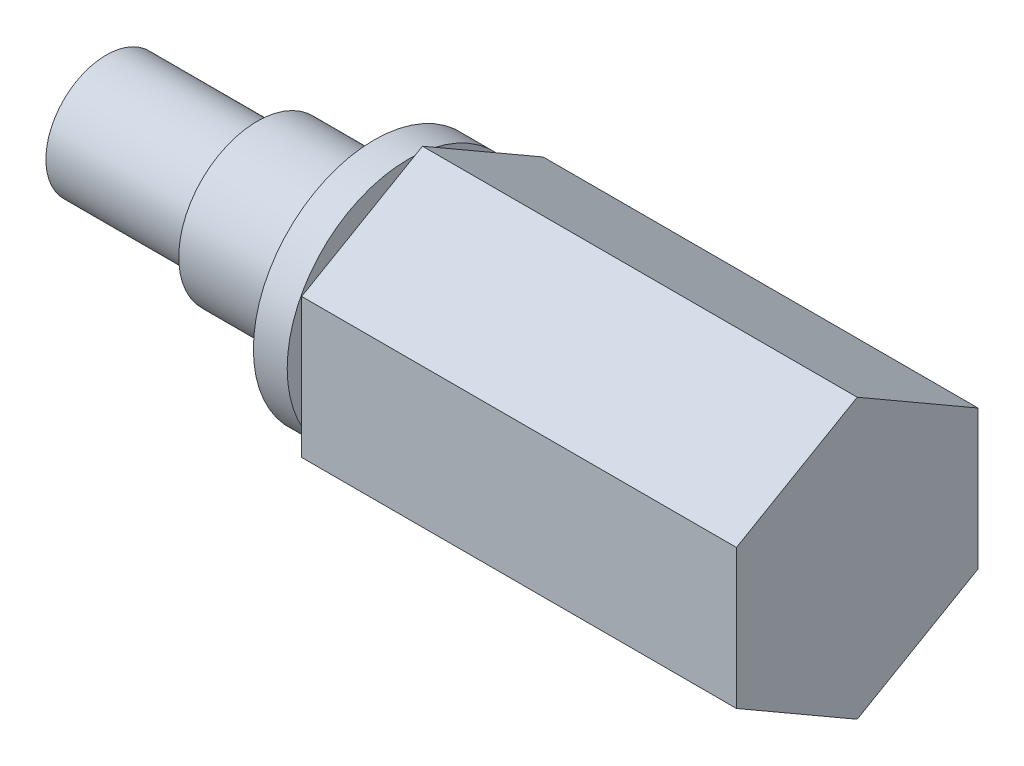
ISO-10303-21;
HEADER;
FILE_DESCRIPTION(('STEP AP214'),'2;1');
FILE_NAME('part.step','',(''),(''),'','','');
FILE_SCHEMA(('AUTOMOTIVE_DESIGN { 1 0 10303 214 1 1 1 1 }'));
ENDSEC;
DATA;
#1=APPLICATION_CONTEXT('core data for automotive mechanical design processes');
#2=APPLICATION_PROTOCOL_DEFINITION('international standard','automotive_design',2000,#1);
#3=PRODUCT_CONTEXT('',#1,'mechanical');
#4=PRODUCT('Part','Part','',(#3));
#5=PRODUCT_RELATED_PRODUCT_CATEGORY('part','',(#4));
#6=PRODUCT_DEFINITION_FORMATION('','',#4);
#7=PRODUCT_DEFINITION_CONTEXT('part definition',#1,'design');
#8=PRODUCT_DEFINITION('design','',#6,#7);
#9=PRODUCT_DEFINITION_SHAPE('','',#8);
#10=(LENGTH_UNIT() NAMED_UNIT(*) SI_UNIT(.MILLI.,.METRE.));
#11=(NAMED_UNIT(*) PLANE_ANGLE_UNIT() SI_UNIT($,.RADIAN.));
#12=(NAMED_UNIT(*) SI_UNIT($,.STERADIAN.) SOLID_ANGLE_UNIT());
#13=UNCERTAINTY_MEASURE_WITH_UNIT(LENGTH_MEASURE(1.E-05),#10,'distance_accuracy_value','');
#14=(GEOMETRIC_REPRESENTATION_CONTEXT(3) GLOBAL_UNCERTAINTY_ASSIGNED_CONTEXT((#13)) GLOBAL_UNIT_ASSIGNED_CONTEXT((#10,
#11,#12)) REPRESENTATION_CONTEXT('',''));
#15=CARTESIAN_POINT('',(0.,0.,0.));
#16=DIRECTION('',(0.,0.,1.));
#17=DIRECTION('',(1.,0.,0.));
#18=AXIS2_PLACEMENT_3D('',#15,#16,#17);
#19=CARTESIAN_POINT('',(-22.86,6.35,0.));
#20=DIRECTION('',(-1.,0.,0.));
#21=DIRECTION('',(0.,0.,1.));
#22=AXIS2_PLACEMENT_3D('',#19,#20,#21);
#23=PLANE('',#22);
#24=CARTESIAN_POINT('',(-22.86,0.,0.));
#25=DIRECTION('',(1.,0.,0.));
#26=DIRECTION('',(0.,0.,-1.));
#27=AXIS2_PLACEMENT_3D('',#24,#25,#26);
#28=CIRCLE('',#27,5.24168743665283);
#29=CARTESIAN_POINT('',(-22.86,0.,-5.24168743665283));
#30=VERTEX_POINT('',#29);
#31=EDGE_CURVE('E11',#30,#30,#28,.T.);
#32=ORIENTED_EDGE('',*,*,#31,.T.);
#33=EDGE_LOOP('',(#32));
#34=FACE_BOUND('',#33,.T.);
#35=DIRECTION('',(0.,-0.5,0.866025403784438));
#36=VECTOR('',#35,1.);
#37=CARTESIAN_POINT('',(-22.86,7.33234841870825,0.));
#38=LINE('',#37,#36);
#39=CARTESIAN_POINT('',(-22.86,7.33234841870825,0.));
#40=VERTEX_POINT('',#39);
#41=CARTESIAN_POINT('',(-22.86,3.66617420935412,6.35));
#42=VERTEX_POINT('',#41);
#43=EDGE_CURVE('E123',#40,#42,#38,.T.);
#44=ORIENTED_EDGE('',*,*,#43,.F.);
#45=DIRECTION('',(0.,0.5,0.866025403784439));
#46=VECTOR('',#45,1.);
#47=CARTESIAN_POINT('',(-22.86,3.66617420935412,-6.35));
#48=LINE('',#47,#46);
#49=CARTESIAN_POINT('',(-22.86,3.66617420935413,-6.35));
#50=VERTEX_POINT('',#49);
#51=EDGE_CURVE('E169',#50,#40,#48,.T.);
#52=ORIENTED_EDGE('',*,*,#51,.F.);
#53=DIRECTION('',(0.,1.,0.));
#54=VECTOR('',#53,1.);
#55=CARTESIAN_POINT('',(-22.86,-3.66617420935412,-6.35));
#56=LINE('',#55,#54);
#57=CARTESIAN_POINT('',(-22.86,-3.66617420935412,-6.35));
#58=VERTEX_POINT('',#57);
#59=EDGE_CURVE('E184',#58,#50,#56,.T.);
#60=ORIENTED_EDGE('',*,*,#59,.F.);
#61=DIRECTION('',(0.,0.5,-0.866025403784439));
#62=VECTOR('',#61,1.);
#63=CARTESIAN_POINT('',(-22.86,-7.33234841870825,0.));
#64=LINE('',#63,#62);
#65=CARTESIAN_POINT('',(-22.86,-7.33234841870825,0.));
#66=VERTEX_POINT('',#65);
#67=EDGE_CURVE('E186',#66,#58,#64,.T.);
#68=ORIENTED_EDGE('',*,*,#67,.F.);
#69=DIRECTION('',(0.,-0.5,-0.866025403784439));
#70=VECTOR('',#69,1.);
#71=CARTESIAN_POINT('',(-22.86,-3.66617420935412,6.35));
#72=LINE('',#71,#70);
#73=CARTESIAN_POINT('',(-22.86,-3.66617420935412,6.35));
#74=VERTEX_POINT('',#73);
#75=EDGE_CURVE('E82',#74,#66,#72,.T.);
#76=ORIENTED_EDGE('',*,*,#75,.F.);
#77=DIRECTION('',(0.,-1.,0.));
#78=VECTOR('',#77,1.);
#79=CARTESIAN_POINT('',(-22.86,3.66617420935412,6.35));
#80=LINE('',#79,#78);
#81=EDGE_CURVE('E87',#42,#74,#80,.T.);
#82=ORIENTED_EDGE('',*,*,#81,.F.);
#83=EDGE_LOOP('',(#44,#52,#60,#68,#76,#82));
#84=FACE_BOUND('',#83,.T.);
#85=ADVANCED_FACE('F41',(#34,#84),#23,.T.);
#86=CARTESIAN_POINT('',(0.,0.,0.));
#87=DIRECTION('',(1.,0.,0.));
#88=DIRECTION('',(0.,0.,-1.));
#89=AXIS2_PLACEMENT_3D('',#86,#87,#88);
#90=CYLINDRICAL_SURFACE('',#89,5.24168743665283);
#91=CARTESIAN_POINT('',(-23.622,0.,0.));
#92=DIRECTION('',(1.,0.,0.));
#93=DIRECTION('',(0.,0.,-1.));
#94=AXIS2_PLACEMENT_3D('',#91,#92,#93);
#95=CIRCLE('',#94,5.24168743665283);
#96=CARTESIAN_POINT('',(-23.622,0.,-5.24168743665283));
#97=VERTEX_POINT('',#96);
#98=EDGE_CURVE('E50',#97,#97,#95,.T.);
#99=ORIENTED_EDGE('',*,*,#98,.T.);
#100=EDGE_LOOP('',(#99));
#101=FACE_BOUND('',#100,.T.);
#102=ORIENTED_EDGE('',*,*,#31,.F.);
#103=EDGE_LOOP('',(#102));
#104=FACE_BOUND('',#103,.T.);
#105=ADVANCED_FACE('F143',(#101,#104),#90,.T.);
#106=CARTESIAN_POINT('',(-23.622,5.24168743665283,0.));
#107=DIRECTION('',(1.,0.,0.));
#108=DIRECTION('',(0.,0.,-1.));
#109=AXIS2_PLACEMENT_3D('',#106,#107,#108);
#110=PLANE('',#109);
#111=CARTESIAN_POINT('',(-23.622,0.,0.));
#112=DIRECTION('',(1.,0.,0.));
#113=DIRECTION('',(0.,0.,-1.));
#114=AXIS2_PLACEMENT_3D('',#111,#112,#113);
#115=CIRCLE('',#114,6.35);
#116=CARTESIAN_POINT('',(-23.622,0.,-6.35));
#117=VERTEX_POINT('',#116);
#118=EDGE_CURVE('E138',#117,#117,#115,.T.);
#119=ORIENTED_EDGE('',*,*,#118,.T.);
#120=EDGE_LOOP('',(#119));
#121=FACE_BOUND('',#120,.T.);
#122=ORIENTED_EDGE('',*,*,#98,.F.);
#123=EDGE_LOOP('',(#122));
#124=FACE_BOUND('',#123,.T.);
#125=ADVANCED_FACE('F146',(#121,#124),#110,.T.);
#126=CARTESIAN_POINT('',(0.,0.,0.));
#127=DIRECTION('',(1.,0.,0.));
#128=DIRECTION('',(0.,0.,-1.));
#129=AXIS2_PLACEMENT_3D('',#126,#127,#128);
#130=CYLINDRICAL_SURFACE('',#129,6.35);
#131=CARTESIAN_POINT('',(-25.4,0.,0.));
#132=DIRECTION('',(1.,0.,0.));
#133=DIRECTION('',(0.,0.,-1.));
#134=AXIS2_PLACEMENT_3D('',#131,#132,#133);
#135=CIRCLE('',#134,6.35);
#136=CARTESIAN_POINT('',(-25.4,0.,-6.35));
#137=VERTEX_POINT('',#136);
#138=EDGE_CURVE('E135',#137,#137,#135,.T.);
#139=ORIENTED_EDGE('',*,*,#138,.T.);
#140=EDGE_LOOP('',(#139));
#141=FACE_BOUND('',#140,.T.);
#142=ORIENTED_EDGE('',*,*,#118,.F.);
#143=EDGE_LOOP('',(#142));
#144=FACE_BOUND('',#143,.T.);
#145=ADVANCED_FACE('F148',(#141,#144),#130,.T.);
#146=CARTESIAN_POINT('',(-25.4,6.35,0.));
#147=DIRECTION('',(-1.,0.,0.));
#148=DIRECTION('',(0.,0.,1.));
#149=AXIS2_PLACEMENT_3D('',#146,#147,#148);
#150=PLANE('',#149);
#151=CARTESIAN_POINT('',(-25.4,0.,0.));
#152=DIRECTION('',(1.,0.,0.));
#153=DIRECTION('',(0.,0.,-1.));
#154=AXIS2_PLACEMENT_3D('',#151,#152,#153);
#155=CIRCLE('',#154,4.1275);
#156=CARTESIAN_POINT('',(-25.4,0.,-4.1275));
#157=VERTEX_POINT('',#156);
#158=EDGE_CURVE('E132',#157,#157,#155,.T.);
#159=ORIENTED_EDGE('',*,*,#158,.T.);
#160=EDGE_LOOP('',(#159));
#161=FACE_BOUND('',#160,.T.);
#162=ORIENTED_EDGE('',*,*,#138,.F.);
#163=EDGE_LOOP('',(#162));
#164=FACE_BOUND('',#163,.T.);
#165=ADVANCED_FACE('F155',(#161,#164),#150,.T.);
#166=CARTESIAN_POINT('',(0.,0.,0.));
#167=DIRECTION('',(1.,0.,0.));
#168=DIRECTION('',(0.,0.,-1.));
#169=AXIS2_PLACEMENT_3D('',#166,#167,#168);
#170=CYLINDRICAL_SURFACE('',#169,4.1275);
#171=CARTESIAN_POINT('',(-31.5468,0.,0.));
#172=DIRECTION('',(1.,0.,0.));
#173=DIRECTION('',(0.,0.,-1.));
#174=AXIS2_PLACEMENT_3D('',#171,#172,#173);
#175=CIRCLE('',#174,4.1275);
#176=CARTESIAN_POINT('',(-31.5468,0.,-4.1275));
#177=VERTEX_POINT('',#176);
#178=EDGE_CURVE('E129',#177,#177,#175,.T.);
#179=ORIENTED_EDGE('',*,*,#178,.T.);
#180=EDGE_LOOP('',(#179));
#181=FACE_BOUND('',#180,.T.);
#182=ORIENTED_EDGE('',*,*,#158,.F.);
#183=EDGE_LOOP('',(#182));
#184=FACE_BOUND('',#183,.T.);
#185=ADVANCED_FACE('F222',(#181,#184),#170,.T.);
#186=CARTESIAN_POINT('',(-31.5468,4.1275,0.));
#187=DIRECTION('',(-1.,0.,0.));
#188=DIRECTION('',(0.,0.,1.));
#189=AXIS2_PLACEMENT_3D('',#186,#187,#188);
#190=PLANE('',#189);
#191=CARTESIAN_POINT('',(-31.5468,0.,0.));
#192=DIRECTION('',(1.,0.,0.));
#193=DIRECTION('',(0.,0.,-1.));
#194=AXIS2_PLACEMENT_3D('',#191,#192,#193);
#195=CIRCLE('',#194,3.175);
#196=CARTESIAN_POINT('',(-31.5468,0.,-3.175));
#197=VERTEX_POINT('',#196);
#198=EDGE_CURVE('E126',#197,#197,#195,.T.);
#199=ORIENTED_EDGE('',*,*,#198,.T.);
#200=EDGE_LOOP('',(#199));
#201=FACE_BOUND('',#200,.T.);
#202=ORIENTED_EDGE('',*,*,#178,.F.);
#203=EDGE_LOOP('',(#202));
#204=FACE_BOUND('',#203,.T.);
#205=ADVANCED_FACE('F218',(#201,#204),#190,.T.);
#206=CARTESIAN_POINT('',(0.,0.,0.));
#207=DIRECTION('',(1.,0.,0.));
#208=DIRECTION('',(0.,0.,-1.));
#209=AXIS2_PLACEMENT_3D('',#206,#207,#208);
#210=CYLINDRICAL_SURFACE('',#209,3.175);
#211=CARTESIAN_POINT('',(-39.4843,0.,0.));
#212=DIRECTION('',(1.,0.,0.));
#213=DIRECTION('',(0.,0.,-1.));
#214=AXIS2_PLACEMENT_3D('',#211,#212,#213);
#215=CIRCLE('',#214,3.175);
#216=CARTESIAN_POINT('',(-39.4843,0.,-3.175));
#217=VERTEX_POINT('',#216);
#218=EDGE_CURVE('E122',#217,#217,#215,.T.);
#219=ORIENTED_EDGE('',*,*,#218,.T.);
#220=EDGE_LOOP('',(#219));
#221=FACE_BOUND('',#220,.T.);
#222=ORIENTED_EDGE('',*,*,#198,.F.);
#223=EDGE_LOOP('',(#222));
#224=FACE_BOUND('',#223,.T.);
#225=ADVANCED_FACE('F214',(#221,#224),#210,.T.);
#226=CARTESIAN_POINT('',(-39.4843,3.175,0.));
#227=DIRECTION('',(-1.,0.,0.));
#228=DIRECTION('',(0.,0.,1.));
#229=AXIS2_PLACEMENT_3D('',#226,#227,#228);
#230=PLANE('',#229);
#231=ORIENTED_EDGE('',*,*,#218,.F.);
#232=EDGE_LOOP('',(#231));
#233=FACE_BOUND('',#232,.T.);
#234=ADVANCED_FACE('F211',(#233),#230,.T.);
#235=CARTESIAN_POINT('',(-42.2595704419797,3.66617420935412,6.35));
#236=DIRECTION('',(0.,0.,1.));
#237=DIRECTION('',(0.,-1.,0.));
#238=AXIS2_PLACEMENT_3D('',#235,#236,#237);
#239=PLANE('',#238);
#240=ORIENTED_EDGE('',*,*,#81,.T.);
#241=DIRECTION('',(1.,0.,0.));
#242=VECTOR('',#241,1.);
#243=CARTESIAN_POINT('',(-42.2595704419797,-3.66617420935412,6.35));
#244=LINE('',#243,#242);
#245=CARTESIAN_POINT('',(0.,-3.66617420935412,6.35));
#246=VERTEX_POINT('',#245);
#247=EDGE_CURVE('E104',#74,#246,#244,.T.);
#248=ORIENTED_EDGE('',*,*,#247,.T.);
#249=DIRECTION('',(0.,-1.,0.));
#250=VECTOR('',#249,1.);
#251=CARTESIAN_POINT('',(0.,3.66617420935412,6.35));
#252=LINE('',#251,#250);
#253=CARTESIAN_POINT('',(0.,3.66617420935412,6.35));
#254=VERTEX_POINT('',#253);
#255=EDGE_CURVE('E58',#254,#246,#252,.T.);
#256=ORIENTED_EDGE('',*,*,#255,.F.);
#257=DIRECTION('',(1.,0.,0.));
#258=VECTOR('',#257,1.);
#259=CARTESIAN_POINT('',(-42.2595704419797,3.66617420935412,6.35));
#260=LINE('',#259,#258);
#261=EDGE_CURVE('E120',#42,#254,#260,.T.);
#262=ORIENTED_EDGE('',*,*,#261,.F.);
#263=EDGE_LOOP('',(#240,#248,#256,#262));
#264=FACE_BOUND('',#263,.T.);
#265=ADVANCED_FACE('F112',(#264),#239,.T.);
#266=CARTESIAN_POINT('',(-42.2595704419797,-3.66617420935412,6.35));
#267=DIRECTION('',(0.,-0.866025403784439,0.5));
#268=DIRECTION('',(0.,-0.5,-0.866025403784439));
#269=AXIS2_PLACEMENT_3D('',#266,#267,#268);
#270=PLANE('',#269);
#271=ORIENTED_EDGE('',*,*,#75,.T.);
#272=DIRECTION('',(1.,0.,0.));
#273=VECTOR('',#272,1.);
#274=CARTESIAN_POINT('',(-42.2595704419797,-7.33234841870825,0.));
#275=LINE('',#274,#273);
#276=CARTESIAN_POINT('',(0.,-7.33234841870825,0.));
#277=VERTEX_POINT('',#276);
#278=EDGE_CURVE('E105',#66,#277,#275,.T.);
#279=ORIENTED_EDGE('',*,*,#278,.T.);
#280=DIRECTION('',(0.,-0.5,-0.866025403784439));
#281=VECTOR('',#280,1.);
#282=CARTESIAN_POINT('',(0.,-3.66617420935412,6.35));
#283=LINE('',#282,#281);
#284=EDGE_CURVE('E102',#246,#277,#283,.T.);
#285=ORIENTED_EDGE('',*,*,#284,.F.);
#286=ORIENTED_EDGE('',*,*,#247,.F.);
#287=EDGE_LOOP('',(#271,#279,#285,#286));
#288=FACE_BOUND('',#287,.T.);
#289=ADVANCED_FACE('F103',(#288),#270,.T.);
#290=CARTESIAN_POINT('',(-42.2595704419797,-7.33234841870825,0.));
#291=DIRECTION('',(0.,-0.866025403784438,-0.5));
#292=DIRECTION('',(0.,0.5,-0.866025403784439));
#293=AXIS2_PLACEMENT_3D('',#290,#291,#292);
#294=PLANE('',#293);
#295=ORIENTED_EDGE('',*,*,#67,.T.);
#296=DIRECTION('',(1.,0.,0.));
#297=VECTOR('',#296,1.);
#298=CARTESIAN_POINT('',(-42.2595704419797,-3.66617420935412,-6.35));
#299=LINE('',#298,#297);
#300=CARTESIAN_POINT('',(0.,-3.66617420935412,-6.35));
#301=VERTEX_POINT('',#300);
#302=EDGE_CURVE('E185',#58,#301,#299,.T.);
#303=ORIENTED_EDGE('',*,*,#302,.T.);
#304=DIRECTION('',(0.,0.5,-0.866025403784438));
#305=VECTOR('',#304,1.);
#306=CARTESIAN_POINT('',(0.,-7.33234841870825,0.));
#307=LINE('',#306,#305);
#308=EDGE_CURVE('E99',#277,#301,#307,.T.);
#309=ORIENTED_EDGE('',*,*,#308,.F.);
#310=ORIENTED_EDGE('',*,*,#278,.F.);
#311=EDGE_LOOP('',(#295,#303,#309,#310));
#312=FACE_BOUND('',#311,.T.);
#313=ADVANCED_FACE('F198',(#312),#294,.T.);
#314=CARTESIAN_POINT('',(-42.2595704419797,-3.66617420935412,-6.35));
#315=DIRECTION('',(0.,0.,-1.));
#316=DIRECTION('',(0.,1.,0.));
#317=AXIS2_PLACEMENT_3D('',#314,#315,#316);
#318=PLANE('',#317);
#319=ORIENTED_EDGE('',*,*,#59,.T.);
#320=DIRECTION('',(1.,0.,0.));
#321=VECTOR('',#320,1.);
#322=CARTESIAN_POINT('',(-42.2595704419797,3.66617420935412,-6.35));
#323=LINE('',#322,#321);
#324=CARTESIAN_POINT('',(0.,3.66617420935412,-6.35));
#325=VERTEX_POINT('',#324);
#326=EDGE_CURVE('E179',#50,#325,#323,.T.);
#327=ORIENTED_EDGE('',*,*,#326,.T.);
#328=DIRECTION('',(0.,1.,0.));
#329=VECTOR('',#328,1.);
#330=CARTESIAN_POINT('',(0.,-3.66617420935412,-6.35));
#331=LINE('',#330,#329);
#332=EDGE_CURVE('E193',#301,#325,#331,.T.);
#333=ORIENTED_EDGE('',*,*,#332,.F.);
#334=ORIENTED_EDGE('',*,*,#302,.F.);
#335=EDGE_LOOP('',(#319,#327,#333,#334));
#336=FACE_BOUND('',#335,.T.);
#337=ADVANCED_FACE('F197',(#336),#318,.T.);
#338=CARTESIAN_POINT('',(-42.2595704419797,3.66617420935412,-6.35));
#339=DIRECTION('',(0.,0.866025403784439,-0.5));
#340=DIRECTION('',(0.,0.5,0.866025403784439));
#341=AXIS2_PLACEMENT_3D('',#338,#339,#340);
#342=PLANE('',#341);
#343=ORIENTED_EDGE('',*,*,#51,.T.);
#344=DIRECTION('',(1.,0.,0.));
#345=VECTOR('',#344,1.);
#346=CARTESIAN_POINT('',(-42.2595704419797,7.33234841870825,0.));
#347=LINE('',#346,#345);
#348=CARTESIAN_POINT('',(0.,7.33234841870825,0.));
#349=VERTEX_POINT('',#348);
#350=EDGE_CURVE('E172',#40,#349,#347,.T.);
#351=ORIENTED_EDGE('',*,*,#350,.T.);
#352=DIRECTION('',(0.,0.5,0.866025403784439));
#353=VECTOR('',#352,1.);
#354=CARTESIAN_POINT('',(0.,3.66617420935412,-6.35));
#355=LINE('',#354,#353);
#356=EDGE_CURVE('E115',#325,#349,#355,.T.);
#357=ORIENTED_EDGE('',*,*,#356,.F.);
#358=ORIENTED_EDGE('',*,*,#326,.F.);
#359=EDGE_LOOP('',(#343,#351,#357,#358));
#360=FACE_BOUND('',#359,.T.);
#361=ADVANCED_FACE('F195',(#360),#342,.T.);
#362=CARTESIAN_POINT('',(-42.2595704419797,7.33234841870825,0.));
#363=DIRECTION('',(0.,0.866025403784438,0.5));
#364=DIRECTION('',(0.,-0.5,0.866025403784438));
#365=AXIS2_PLACEMENT_3D('',#362,#363,#364);
#366=PLANE('',#365);
#367=ORIENTED_EDGE('',*,*,#43,.T.);
#368=ORIENTED_EDGE('',*,*,#261,.T.);
#369=DIRECTION('',(0.,-0.5,0.866025403784438));
#370=VECTOR('',#369,1.);
#371=CARTESIAN_POINT('',(0.,7.33234841870825,0.));
#372=LINE('',#371,#370);
#373=EDGE_CURVE('E109',#349,#254,#372,.T.);
#374=ORIENTED_EDGE('',*,*,#373,.F.);
#375=ORIENTED_EDGE('',*,*,#350,.F.);
#376=EDGE_LOOP('',(#367,#368,#374,#375));
#377=FACE_BOUND('',#376,.T.);
#378=ADVANCED_FACE('F175',(#377),#366,.T.);
#379=CARTESIAN_POINT('',(0.,0.,0.));
#380=DIRECTION('',(1.,0.,0.));
#381=DIRECTION('',(0.,0.,-1.));
#382=AXIS2_PLACEMENT_3D('',#379,#380,#381);
#383=PLANE('',#382);
#384=ORIENTED_EDGE('',*,*,#284,.T.);
#385=ORIENTED_EDGE('',*,*,#308,.T.);
#386=ORIENTED_EDGE('',*,*,#332,.T.);
#387=ORIENTED_EDGE('',*,*,#356,.T.);
#388=ORIENTED_EDGE('',*,*,#373,.T.);
#389=ORIENTED_EDGE('',*,*,#255,.T.);
#390=EDGE_LOOP('',(#384,#385,#386,#387,#388,#389));
#391=FACE_BOUND('',#390,.T.);
#392=ADVANCED_FACE('F43',(#391),#383,.T.);
#393=CLOSED_SHELL('',(#85,#105,#125,#145,#165,#185,#205,#225,#234,#265,#289,#313,#337,#361,#378,#392));
#394=MANIFOLD_SOLID_BREP('B2',#393);
#395=ADVANCED_BREP_SHAPE_REPRESENTATION('',(#18,#394),#14);
#396=SHAPE_DEFINITION_REPRESENTATION(#9,#395);
ENDSEC;
END-ISO-10303-21;
